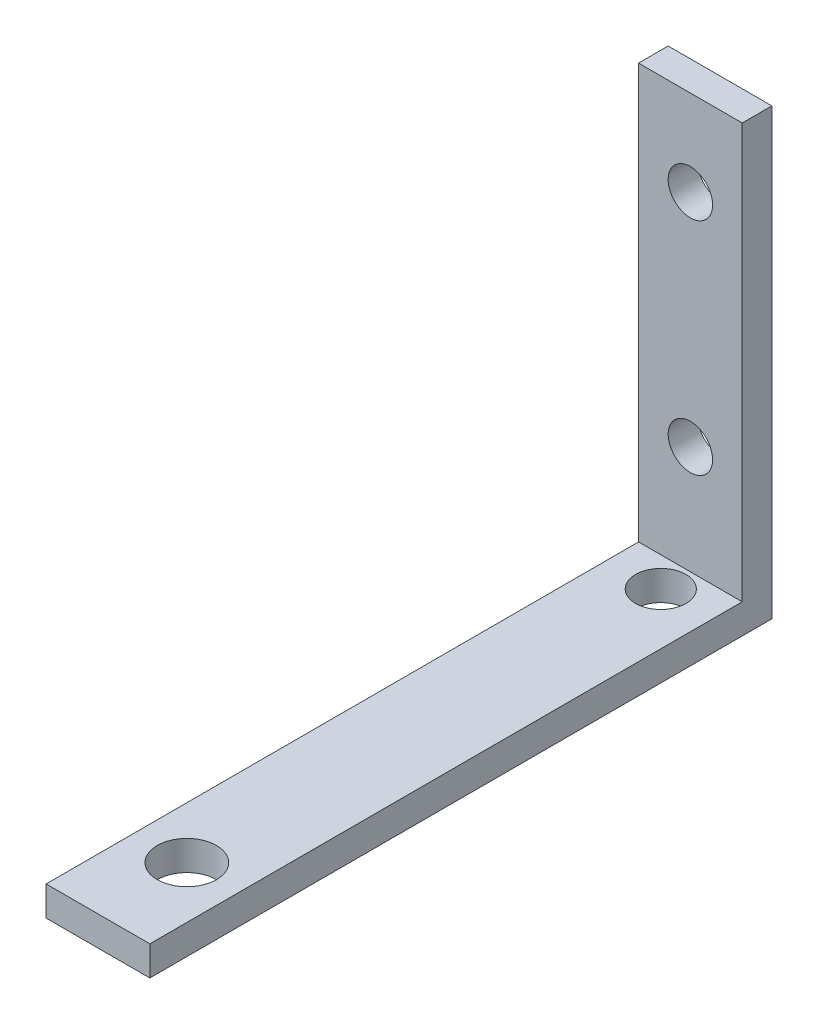
ISO-10303-21;
HEADER;
FILE_DESCRIPTION(('STEP AP214'),'2;1');
FILE_NAME('part.step','',(''),(''),'','','');
FILE_SCHEMA(('AUTOMOTIVE_DESIGN { 1 0 10303 214 1 1 1 1 }'));
ENDSEC;
DATA;
#1=APPLICATION_CONTEXT('core data for automotive mechanical design processes');
#2=APPLICATION_PROTOCOL_DEFINITION('international standard','automotive_design',2000,#1);
#3=PRODUCT_CONTEXT('',#1,'mechanical');
#4=PRODUCT('Part','Part','',(#3));
#5=PRODUCT_RELATED_PRODUCT_CATEGORY('part','',(#4));
#6=PRODUCT_DEFINITION_FORMATION('','',#4);
#7=PRODUCT_DEFINITION_CONTEXT('part definition',#1,'design');
#8=PRODUCT_DEFINITION('design','',#6,#7);
#9=PRODUCT_DEFINITION_SHAPE('','',#8);
#10=(LENGTH_UNIT() NAMED_UNIT(*) SI_UNIT(.MILLI.,.METRE.));
#11=(NAMED_UNIT(*) PLANE_ANGLE_UNIT() SI_UNIT($,.RADIAN.));
#12=(NAMED_UNIT(*) SI_UNIT($,.STERADIAN.) SOLID_ANGLE_UNIT());
#13=UNCERTAINTY_MEASURE_WITH_UNIT(LENGTH_MEASURE(1.E-05),#10,'distance_accuracy_value','');
#14=(GEOMETRIC_REPRESENTATION_CONTEXT(3) GLOBAL_UNCERTAINTY_ASSIGNED_CONTEXT((#13)) GLOBAL_UNIT_ASSIGNED_CONTEXT((#10,
#11,#12)) REPRESENTATION_CONTEXT('',''));
#15=CARTESIAN_POINT('',(0.,0.,0.));
#16=DIRECTION('',(0.,0.,1.));
#17=DIRECTION('',(1.,0.,0.));
#18=AXIS2_PLACEMENT_3D('',#15,#16,#17);
#19=CARTESIAN_POINT('',(0.,0.,2.));
#20=DIRECTION('',(0.,0.,-1.));
#21=DIRECTION('',(-1.,0.,0.));
#22=AXIS2_PLACEMENT_3D('',#19,#20,#21);
#23=PLANE('',#22);
#24=CARTESIAN_POINT('',(0.,9.19922826693664,2.));
#25=DIRECTION('',(0.,0.,1.));
#26=DIRECTION('',(1.,0.,0.));
#27=AXIS2_PLACEMENT_3D('',#24,#25,#26);
#28=CIRCLE('',#27,1.5);
#29=CARTESIAN_POINT('',(1.5,9.19922826693664,2.));
#30=VERTEX_POINT('',#29);
#31=EDGE_CURVE('E158',#30,#30,#28,.T.);
#32=ORIENTED_EDGE('',*,*,#31,.F.);
#33=EDGE_LOOP('',(#32));
#34=FACE_BOUND('',#33,.T.);
#35=CARTESIAN_POINT('',(0.,-5.6958739518933,2.));
#36=DIRECTION('',(0.,0.,1.));
#37=DIRECTION('',(1.,0.,0.));
#38=AXIS2_PLACEMENT_3D('',#35,#36,#37);
#39=CIRCLE('',#38,1.5);
#40=CARTESIAN_POINT('',(1.5,-5.6958739518933,2.));
#41=VERTEX_POINT('',#40);
#42=EDGE_CURVE('E147',#41,#41,#39,.T.);
#43=ORIENTED_EDGE('',*,*,#42,.F.);
#44=EDGE_LOOP('',(#43));
#45=FACE_BOUND('',#44,.T.);
#46=DIRECTION('',(-1.,0.,0.));
#47=VECTOR('',#46,1.);
#48=CARTESIAN_POINT('',(3.5,-13.,2.));
#49=LINE('',#48,#47);
#50=CARTESIAN_POINT('',(3.5,-13.,2.));
#51=VERTEX_POINT('',#50);
#52=CARTESIAN_POINT('',(-3.5,-13.,2.));
#53=VERTEX_POINT('',#52);
#54=EDGE_CURVE('E50',#51,#53,#49,.T.);
#55=ORIENTED_EDGE('',*,*,#54,.F.);
#56=DIRECTION('',(0.,1.,0.));
#57=VECTOR('',#56,1.);
#58=CARTESIAN_POINT('',(3.5,-15.,2.));
#59=LINE('',#58,#57);
#60=CARTESIAN_POINT('',(3.5,15.,2.));
#61=VERTEX_POINT('',#60);
#62=EDGE_CURVE('E87',#51,#61,#59,.T.);
#63=ORIENTED_EDGE('',*,*,#62,.T.);
#64=DIRECTION('',(-1.,0.,0.));
#65=VECTOR('',#64,1.);
#66=CARTESIAN_POINT('',(-3.5,15.,2.));
#67=LINE('',#66,#65);
#68=CARTESIAN_POINT('',(-3.5,15.,2.));
#69=VERTEX_POINT('',#68);
#70=EDGE_CURVE('E56',#61,#69,#67,.T.);
#71=ORIENTED_EDGE('',*,*,#70,.T.);
#72=DIRECTION('',(0.,-1.,0.));
#73=VECTOR('',#72,1.);
#74=CARTESIAN_POINT('',(-3.5,-15.,2.));
#75=LINE('',#74,#73);
#76=EDGE_CURVE('E98',#69,#53,#75,.T.);
#77=ORIENTED_EDGE('',*,*,#76,.T.);
#78=EDGE_LOOP('',(#55,#63,#71,#77));
#79=FACE_BOUND('',#78,.T.);
#80=ADVANCED_FACE('F33',(#34,#45,#79),#23,.F.);
#81=CARTESIAN_POINT('',(3.5,-15.,2.));
#82=DIRECTION('',(-1.,0.,0.));
#83=DIRECTION('',(0.,0.,1.));
#84=AXIS2_PLACEMENT_3D('',#81,#82,#83);
#85=PLANE('',#84);
#86=DIRECTION('',(0.,1.,0.));
#87=VECTOR('',#86,1.);
#88=CARTESIAN_POINT('',(3.5,-15.,0.));
#89=LINE('',#88,#87);
#90=CARTESIAN_POINT('',(3.5,-15.,0.));
#91=VERTEX_POINT('',#90);
#92=CARTESIAN_POINT('',(3.5,15.,0.));
#93=VERTEX_POINT('',#92);
#94=EDGE_CURVE('E94',#91,#93,#89,.T.);
#95=ORIENTED_EDGE('',*,*,#94,.T.);
#96=DIRECTION('',(0.,0.,-1.));
#97=VECTOR('',#96,1.);
#98=CARTESIAN_POINT('',(3.5,15.,2.));
#99=LINE('',#98,#97);
#100=EDGE_CURVE('E11',#61,#93,#99,.T.);
#101=ORIENTED_EDGE('',*,*,#100,.F.);
#102=ORIENTED_EDGE('',*,*,#62,.F.);
#103=DIRECTION('',(0.,0.,-1.));
#104=VECTOR('',#103,1.);
#105=CARTESIAN_POINT('',(3.5,-13.,42.));
#106=LINE('',#105,#104);
#107=CARTESIAN_POINT('',(3.5,-13.,42.));
#108=VERTEX_POINT('',#107);
#109=EDGE_CURVE('E102',#108,#51,#106,.T.);
#110=ORIENTED_EDGE('',*,*,#109,.F.);
#111=DIRECTION('',(0.,1.,0.));
#112=VECTOR('',#111,1.);
#113=CARTESIAN_POINT('',(3.5,-15.,42.));
#114=LINE('',#113,#112);
#115=CARTESIAN_POINT('',(3.5,-15.,42.));
#116=VERTEX_POINT('',#115);
#117=EDGE_CURVE('E97',#116,#108,#114,.T.);
#118=ORIENTED_EDGE('',*,*,#117,.F.);
#119=DIRECTION('',(0.,0.,-1.));
#120=VECTOR('',#119,1.);
#121=CARTESIAN_POINT('',(3.5,-15.,2.));
#122=LINE('',#121,#120);
#123=EDGE_CURVE('E80',#116,#91,#122,.T.);
#124=ORIENTED_EDGE('',*,*,#123,.T.);
#125=EDGE_LOOP('',(#95,#101,#102,#110,#118,#124));
#126=FACE_BOUND('',#125,.T.);
#127=ADVANCED_FACE('F35',(#126),#85,.F.);
#128=CARTESIAN_POINT('',(-3.5,15.,2.));
#129=DIRECTION('',(0.,-1.,0.));
#130=DIRECTION('',(0.,0.,-1.));
#131=AXIS2_PLACEMENT_3D('',#128,#129,#130);
#132=PLANE('',#131);
#133=DIRECTION('',(-1.,0.,0.));
#134=VECTOR('',#133,1.);
#135=CARTESIAN_POINT('',(-3.5,15.,0.));
#136=LINE('',#135,#134);
#137=CARTESIAN_POINT('',(-3.5,15.,0.));
#138=VERTEX_POINT('',#137);
#139=EDGE_CURVE('E101',#93,#138,#136,.T.);
#140=ORIENTED_EDGE('',*,*,#139,.T.);
#141=DIRECTION('',(0.,0.,-1.));
#142=VECTOR('',#141,1.);
#143=CARTESIAN_POINT('',(-3.5,15.,2.));
#144=LINE('',#143,#142);
#145=EDGE_CURVE('E42',#69,#138,#144,.T.);
#146=ORIENTED_EDGE('',*,*,#145,.F.);
#147=ORIENTED_EDGE('',*,*,#70,.F.);
#148=ORIENTED_EDGE('',*,*,#100,.T.);
#149=EDGE_LOOP('',(#140,#146,#147,#148));
#150=FACE_BOUND('',#149,.T.);
#151=ADVANCED_FACE('F180',(#150),#132,.F.);
#152=CARTESIAN_POINT('',(-3.5,-15.,2.));
#153=DIRECTION('',(1.,0.,0.));
#154=DIRECTION('',(0.,0.,-1.));
#155=AXIS2_PLACEMENT_3D('',#152,#153,#154);
#156=PLANE('',#155);
#157=DIRECTION('',(0.,-1.,0.));
#158=VECTOR('',#157,1.);
#159=CARTESIAN_POINT('',(-3.5,-15.,0.));
#160=LINE('',#159,#158);
#161=CARTESIAN_POINT('',(-3.5,-15.,0.));
#162=VERTEX_POINT('',#161);
#163=EDGE_CURVE('E88',#138,#162,#160,.T.);
#164=ORIENTED_EDGE('',*,*,#163,.T.);
#165=DIRECTION('',(0.,0.,-1.));
#166=VECTOR('',#165,1.);
#167=CARTESIAN_POINT('',(-3.5,-15.,2.));
#168=LINE('',#167,#166);
#169=CARTESIAN_POINT('',(-3.5,-15.,42.));
#170=VERTEX_POINT('',#169);
#171=EDGE_CURVE('E83',#170,#162,#168,.T.);
#172=ORIENTED_EDGE('',*,*,#171,.F.);
#173=DIRECTION('',(0.,-1.,0.));
#174=VECTOR('',#173,1.);
#175=CARTESIAN_POINT('',(-3.5,-15.,42.));
#176=LINE('',#175,#174);
#177=CARTESIAN_POINT('',(-3.5,-13.,42.));
#178=VERTEX_POINT('',#177);
#179=EDGE_CURVE('E137',#178,#170,#176,.T.);
#180=ORIENTED_EDGE('',*,*,#179,.F.);
#181=DIRECTION('',(0.,0.,-1.));
#182=VECTOR('',#181,1.);
#183=CARTESIAN_POINT('',(-3.5,-13.,42.));
#184=LINE('',#183,#182);
#185=EDGE_CURVE('E106',#178,#53,#184,.T.);
#186=ORIENTED_EDGE('',*,*,#185,.T.);
#187=ORIENTED_EDGE('',*,*,#76,.F.);
#188=ORIENTED_EDGE('',*,*,#145,.T.);
#189=EDGE_LOOP('',(#164,#172,#180,#186,#187,#188));
#190=FACE_BOUND('',#189,.T.);
#191=ADVANCED_FACE('F135',(#190),#156,.F.);
#192=CARTESIAN_POINT('',(-3.5,-15.,2.));
#193=DIRECTION('',(0.,1.,0.));
#194=DIRECTION('',(0.,0.,1.));
#195=AXIS2_PLACEMENT_3D('',#192,#193,#194);
#196=PLANE('',#195);
#197=CARTESIAN_POINT('',(0.,-15.,36.));
#198=DIRECTION('',(0.,-1.,0.));
#199=DIRECTION('',(0.,0.,-1.));
#200=AXIS2_PLACEMENT_3D('',#197,#198,#199);
#201=CIRCLE('',#200,2.);
#202=CARTESIAN_POINT('',(0.,-15.,34.));
#203=VERTEX_POINT('',#202);
#204=EDGE_CURVE('E146',#203,#203,#201,.T.);
#205=ORIENTED_EDGE('',*,*,#204,.F.);
#206=EDGE_LOOP('',(#205));
#207=FACE_BOUND('',#206,.T.);
#208=CARTESIAN_POINT('',(0.,-15.,4.));
#209=DIRECTION('',(0.,-1.,0.));
#210=DIRECTION('',(0.,0.,-1.));
#211=AXIS2_PLACEMENT_3D('',#208,#209,#210);
#212=CIRCLE('',#211,1.7);
#213=CARTESIAN_POINT('',(0.,-15.,2.3));
#214=VERTEX_POINT('',#213);
#215=EDGE_CURVE('E163',#214,#214,#212,.T.);
#216=ORIENTED_EDGE('',*,*,#215,.F.);
#217=EDGE_LOOP('',(#216));
#218=FACE_BOUND('',#217,.T.);
#219=DIRECTION('',(1.,0.,0.));
#220=VECTOR('',#219,1.);
#221=CARTESIAN_POINT('',(-3.5,-15.,0.));
#222=LINE('',#221,#220);
#223=EDGE_CURVE('E76',#162,#91,#222,.T.);
#224=ORIENTED_EDGE('',*,*,#223,.T.);
#225=ORIENTED_EDGE('',*,*,#123,.F.);
#226=DIRECTION('',(1.,0.,0.));
#227=VECTOR('',#226,1.);
#228=CARTESIAN_POINT('',(3.5,-15.,42.));
#229=LINE('',#228,#227);
#230=EDGE_CURVE('E138',#170,#116,#229,.T.);
#231=ORIENTED_EDGE('',*,*,#230,.F.);
#232=ORIENTED_EDGE('',*,*,#171,.T.);
#233=EDGE_LOOP('',(#224,#225,#231,#232));
#234=FACE_BOUND('',#233,.T.);
#235=ADVANCED_FACE('F78',(#207,#218,#234),#196,.F.);
#236=CARTESIAN_POINT('',(0.,0.,0.));
#237=DIRECTION('',(0.,0.,-1.));
#238=DIRECTION('',(-1.,0.,0.));
#239=AXIS2_PLACEMENT_3D('',#236,#237,#238);
#240=PLANE('',#239);
#241=CARTESIAN_POINT('',(0.,9.19922826693664,0.));
#242=DIRECTION('',(0.,0.,-1.));
#243=DIRECTION('',(-1.,0.,0.));
#244=AXIS2_PLACEMENT_3D('',#241,#242,#243);
#245=CIRCLE('',#244,1.5);
#246=CARTESIAN_POINT('',(-1.5,9.19922826693664,0.));
#247=VERTEX_POINT('',#246);
#248=EDGE_CURVE('E37',#247,#247,#245,.T.);
#249=ORIENTED_EDGE('',*,*,#248,.F.);
#250=EDGE_LOOP('',(#249));
#251=FACE_BOUND('',#250,.T.);
#252=CARTESIAN_POINT('',(0.,-5.6958739518933,0.));
#253=DIRECTION('',(0.,0.,-1.));
#254=DIRECTION('',(-1.,0.,0.));
#255=AXIS2_PLACEMENT_3D('',#252,#253,#254);
#256=CIRCLE('',#255,1.5);
#257=CARTESIAN_POINT('',(-1.5,-5.6958739518933,0.));
#258=VERTEX_POINT('',#257);
#259=EDGE_CURVE('E144',#258,#258,#256,.T.);
#260=ORIENTED_EDGE('',*,*,#259,.F.);
#261=EDGE_LOOP('',(#260));
#262=FACE_BOUND('',#261,.T.);
#263=ORIENTED_EDGE('',*,*,#94,.F.);
#264=ORIENTED_EDGE('',*,*,#223,.F.);
#265=ORIENTED_EDGE('',*,*,#163,.F.);
#266=ORIENTED_EDGE('',*,*,#139,.F.);
#267=EDGE_LOOP('',(#263,#264,#265,#266));
#268=FACE_BOUND('',#267,.T.);
#269=ADVANCED_FACE('F100',(#251,#262,#268),#240,.T.);
#270=CARTESIAN_POINT('',(3.5,-13.,42.));
#271=DIRECTION('',(0.,-1.,0.));
#272=DIRECTION('',(1.,0.,0.));
#273=AXIS2_PLACEMENT_3D('',#270,#271,#272);
#274=PLANE('',#273);
#275=CARTESIAN_POINT('',(0.,-13.,36.));
#276=DIRECTION('',(0.,-1.,0.));
#277=DIRECTION('',(1.,0.,0.));
#278=AXIS2_PLACEMENT_3D('',#275,#276,#277);
#279=CIRCLE('',#278,2.);
#280=CARTESIAN_POINT('',(2.,-13.,36.));
#281=VERTEX_POINT('',#280);
#282=EDGE_CURVE('E151',#281,#281,#279,.F.);
#283=ORIENTED_EDGE('',*,*,#282,.F.);
#284=EDGE_LOOP('',(#283));
#285=FACE_BOUND('',#284,.T.);
#286=CARTESIAN_POINT('',(0.,-13.,4.));
#287=DIRECTION('',(0.,-1.,0.));
#288=DIRECTION('',(1.,0.,0.));
#289=AXIS2_PLACEMENT_3D('',#286,#287,#288);
#290=CIRCLE('',#289,1.7);
#291=CARTESIAN_POINT('',(1.7,-13.,4.));
#292=VERTEX_POINT('',#291);
#293=EDGE_CURVE('E134',#292,#292,#290,.F.);
#294=ORIENTED_EDGE('',*,*,#293,.F.);
#295=EDGE_LOOP('',(#294));
#296=FACE_BOUND('',#295,.T.);
#297=ORIENTED_EDGE('',*,*,#54,.T.);
#298=ORIENTED_EDGE('',*,*,#185,.F.);
#299=DIRECTION('',(-1.,0.,0.));
#300=VECTOR('',#299,1.);
#301=CARTESIAN_POINT('',(3.5,-13.,42.));
#302=LINE('',#301,#300);
#303=EDGE_CURVE('E169',#108,#178,#302,.T.);
#304=ORIENTED_EDGE('',*,*,#303,.F.);
#305=ORIENTED_EDGE('',*,*,#109,.T.);
#306=EDGE_LOOP('',(#297,#298,#304,#305));
#307=FACE_BOUND('',#306,.T.);
#308=ADVANCED_FACE('F130',(#285,#296,#307),#274,.F.);
#309=CARTESIAN_POINT('',(0.,0.,42.));
#310=DIRECTION('',(0.,0.,1.));
#311=DIRECTION('',(1.,0.,0.));
#312=AXIS2_PLACEMENT_3D('',#309,#310,#311);
#313=PLANE('',#312);
#314=ORIENTED_EDGE('',*,*,#117,.T.);
#315=ORIENTED_EDGE('',*,*,#303,.T.);
#316=ORIENTED_EDGE('',*,*,#179,.T.);
#317=ORIENTED_EDGE('',*,*,#230,.T.);
#318=EDGE_LOOP('',(#314,#315,#316,#317));
#319=FACE_BOUND('',#318,.T.);
#320=ADVANCED_FACE('F174',(#319),#313,.T.);
#321=CARTESIAN_POINT('',(0.,15.001025,4.));
#322=DIRECTION('',(0.,-1.,0.));
#323=DIRECTION('',(0.,0.,-1.));
#324=AXIS2_PLACEMENT_3D('',#321,#322,#323);
#325=CYLINDRICAL_SURFACE('',#324,1.7);
#326=ORIENTED_EDGE('',*,*,#215,.T.);
#327=EDGE_LOOP('',(#326));
#328=FACE_BOUND('',#327,.T.);
#329=ORIENTED_EDGE('',*,*,#293,.T.);
#330=EDGE_LOOP('',(#329));
#331=FACE_BOUND('',#330,.T.);
#332=ADVANCED_FACE('F210',(#328,#331),#325,.F.);
#333=CARTESIAN_POINT('',(0.,15.001025,36.));
#334=DIRECTION('',(0.,-1.,0.));
#335=DIRECTION('',(0.,0.,-1.));
#336=AXIS2_PLACEMENT_3D('',#333,#334,#335);
#337=CYLINDRICAL_SURFACE('',#336,2.);
#338=ORIENTED_EDGE('',*,*,#204,.T.);
#339=EDGE_LOOP('',(#338));
#340=FACE_BOUND('',#339,.T.);
#341=ORIENTED_EDGE('',*,*,#282,.T.);
#342=EDGE_LOOP('',(#341));
#343=FACE_BOUND('',#342,.T.);
#344=ADVANCED_FACE('F213',(#340,#343),#337,.F.);
#345=CARTESIAN_POINT('',(0.,-5.6958739518933,-8.));
#346=DIRECTION('',(0.,0.,1.));
#347=DIRECTION('',(1.,0.,0.));
#348=AXIS2_PLACEMENT_3D('',#345,#346,#347);
#349=CYLINDRICAL_SURFACE('',#348,1.5);
#350=ORIENTED_EDGE('',*,*,#259,.T.);
#351=EDGE_LOOP('',(#350));
#352=FACE_BOUND('',#351,.T.);
#353=ORIENTED_EDGE('',*,*,#42,.T.);
#354=EDGE_LOOP('',(#353));
#355=FACE_BOUND('',#354,.T.);
#356=ADVANCED_FACE('F225',(#352,#355),#349,.F.);
#357=CARTESIAN_POINT('',(0.,9.19922826693664,-8.));
#358=DIRECTION('',(0.,0.,1.));
#359=DIRECTION('',(1.,0.,0.));
#360=AXIS2_PLACEMENT_3D('',#357,#358,#359);
#361=CYLINDRICAL_SURFACE('',#360,1.5);
#362=ORIENTED_EDGE('',*,*,#248,.T.);
#363=EDGE_LOOP('',(#362));
#364=FACE_BOUND('',#363,.T.);
#365=ORIENTED_EDGE('',*,*,#31,.T.);
#366=EDGE_LOOP('',(#365));
#367=FACE_BOUND('',#366,.T.);
#368=ADVANCED_FACE('F230',(#364,#367),#361,.F.);
#369=CLOSED_SHELL('',(#80,#127,#151,#191,#235,#269,#308,#320,#332,#344,#356,#368));
#370=MANIFOLD_SOLID_BREP('B2',#369);
#371=ADVANCED_BREP_SHAPE_REPRESENTATION('',(#18,#370),#14);
#372=SHAPE_DEFINITION_REPRESENTATION(#9,#371);
ENDSEC;
END-ISO-10303-21;
